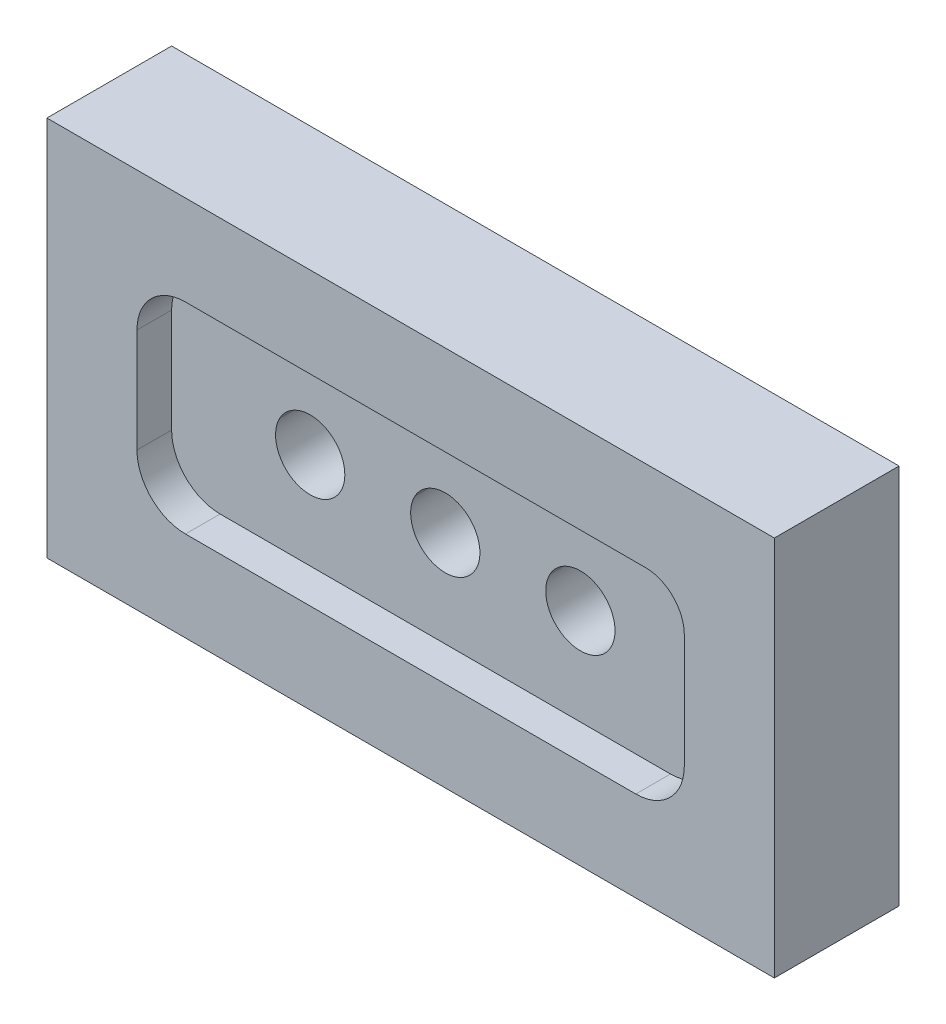
ISO-10303-21;
HEADER;
FILE_DESCRIPTION(('STEP AP214'),'2;1');
FILE_NAME('part.step','',(''),(''),'','','');
FILE_SCHEMA(('AUTOMOTIVE_DESIGN { 1 0 10303 214 1 1 1 1 }'));
ENDSEC;
DATA;
#1=APPLICATION_CONTEXT('core data for automotive mechanical design processes');
#2=APPLICATION_PROTOCOL_DEFINITION('international standard','automotive_design',2000,#1);
#3=PRODUCT_CONTEXT('',#1,'mechanical');
#4=PRODUCT('Part','Part','',(#3));
#5=PRODUCT_RELATED_PRODUCT_CATEGORY('part','',(#4));
#6=PRODUCT_DEFINITION_FORMATION('','',#4);
#7=PRODUCT_DEFINITION_CONTEXT('part definition',#1,'design');
#8=PRODUCT_DEFINITION('design','',#6,#7);
#9=PRODUCT_DEFINITION_SHAPE('','',#8);
#10=(LENGTH_UNIT() NAMED_UNIT(*) SI_UNIT(.MILLI.,.METRE.));
#11=(NAMED_UNIT(*) PLANE_ANGLE_UNIT() SI_UNIT($,.RADIAN.));
#12=(NAMED_UNIT(*) SI_UNIT($,.STERADIAN.) SOLID_ANGLE_UNIT());
#13=UNCERTAINTY_MEASURE_WITH_UNIT(LENGTH_MEASURE(1.E-05),#10,'distance_accuracy_value','');
#14=(GEOMETRIC_REPRESENTATION_CONTEXT(3) GLOBAL_UNCERTAINTY_ASSIGNED_CONTEXT((#13)) GLOBAL_UNIT_ASSIGNED_CONTEXT((#10,
#11,#12)) REPRESENTATION_CONTEXT('',''));
#15=CARTESIAN_POINT('',(0.,0.,0.));
#16=DIRECTION('',(0.,0.,1.));
#17=DIRECTION('',(1.,0.,0.));
#18=AXIS2_PLACEMENT_3D('',#15,#16,#17);
#19=CARTESIAN_POINT('',(105.,36.8980255127,12.9));
#20=DIRECTION('',(0.,0.,-1.));
#21=DIRECTION('',(0.877582561890372,-0.479425538604204,0.));
#22=AXIS2_PLACEMENT_3D('',#19,#20,#21);
#23=CYLINDRICAL_SURFACE('',#22,5.);
#24=CARTESIAN_POINT('',(105.,36.8980255127,13.));
#25=DIRECTION('',(0.,0.,1.));
#26=DIRECTION('',(1.,0.,0.));
#27=AXIS2_PLACEMENT_3D('',#24,#25,#26);
#28=CIRCLE('',#27,5.);
#29=CARTESIAN_POINT('',(100.612087191,39.2951532057,13.));
#30=VERTEX_POINT('',#29);
#31=CARTESIAN_POINT('',(109.387912809,34.5008978197,13.));
#32=VERTEX_POINT('',#31);
#33=EDGE_CURVE('E221',#30,#32,#28,.T.);
#34=ORIENTED_EDGE('',*,*,#33,.T.);
#35=DIRECTION('',(0.,0.,1.));
#36=VECTOR('',#35,1.);
#37=CARTESIAN_POINT('',(109.387912809,34.5008978197,10.6550000001));
#38=LINE('',#37,#36);
#39=CARTESIAN_POINT('',(109.387912809,34.5008978197,3.));
#40=VERTEX_POINT('',#39);
#41=EDGE_CURVE('E9',#40,#32,#38,.T.);
#42=ORIENTED_EDGE('',*,*,#41,.F.);
#43=CARTESIAN_POINT('',(105.,36.8980255127,3.));
#44=DIRECTION('',(0.,0.,-1.));
#45=DIRECTION('',(1.,0.,0.));
#46=AXIS2_PLACEMENT_3D('',#43,#44,#45);
#47=CIRCLE('',#46,5.);
#48=CARTESIAN_POINT('',(100.612087191,39.2951532057,3.));
#49=VERTEX_POINT('',#48);
#50=EDGE_CURVE('E210',#40,#49,#47,.T.);
#51=ORIENTED_EDGE('',*,*,#50,.T.);
#52=DIRECTION('',(0.,0.,1.));
#53=VECTOR('',#52,1.);
#54=CARTESIAN_POINT('',(100.612087191,39.2951532057,10.6550000001));
#55=LINE('',#54,#53);
#56=EDGE_CURVE('E26',#49,#30,#55,.T.);
#57=ORIENTED_EDGE('',*,*,#56,.T.);
#58=EDGE_LOOP('',(#34,#42,#51,#57));
#59=FACE_BOUND('',#58,.T.);
#60=ADVANCED_FACE('F15',(#59),#23,.F.);
#61=CARTESIAN_POINT('',(105.,36.8980255127,12.9));
#62=DIRECTION('',(0.,0.,-1.));
#63=DIRECTION('',(0.877582561890372,-0.479425538604204,0.));
#64=AXIS2_PLACEMENT_3D('',#61,#62,#63);
#65=CYLINDRICAL_SURFACE('',#64,5.);
#66=CARTESIAN_POINT('',(105.,36.8980255127,13.));
#67=DIRECTION('',(0.,0.,1.));
#68=DIRECTION('',(1.,0.,0.));
#69=AXIS2_PLACEMENT_3D('',#66,#67,#68);
#70=CIRCLE('',#69,5.);
#71=EDGE_CURVE('E225',#32,#30,#70,.T.);
#72=ORIENTED_EDGE('',*,*,#71,.T.);
#73=ORIENTED_EDGE('',*,*,#56,.F.);
#74=CARTESIAN_POINT('',(105.,36.8980255127,3.));
#75=DIRECTION('',(0.,0.,-1.));
#76=DIRECTION('',(1.,0.,0.));
#77=AXIS2_PLACEMENT_3D('',#74,#75,#76);
#78=CIRCLE('',#77,5.);
#79=EDGE_CURVE('E347',#49,#40,#78,.T.);
#80=ORIENTED_EDGE('',*,*,#79,.T.);
#81=ORIENTED_EDGE('',*,*,#41,.T.);
#82=EDGE_LOOP('',(#72,#73,#80,#81));
#83=FACE_BOUND('',#82,.T.);
#84=ADVANCED_FACE('F370',(#83),#65,.F.);
#85=CARTESIAN_POINT('',(85.5,36.8980255127,12.9));
#86=DIRECTION('',(0.,0.,-1.));
#87=DIRECTION('',(0.877582561890372,-0.479425538604204,0.));
#88=AXIS2_PLACEMENT_3D('',#85,#86,#87);
#89=CYLINDRICAL_SURFACE('',#88,5.);
#90=CARTESIAN_POINT('',(85.5,36.8980255127,13.));
#91=DIRECTION('',(0.,0.,1.));
#92=DIRECTION('',(1.,0.,0.));
#93=AXIS2_PLACEMENT_3D('',#90,#91,#92);
#94=CIRCLE('',#93,5.);
#95=CARTESIAN_POINT('',(81.1120871905,39.2951532057,13.));
#96=VERTEX_POINT('',#95);
#97=CARTESIAN_POINT('',(89.8879128095,34.5008978197,13.));
#98=VERTEX_POINT('',#97);
#99=EDGE_CURVE('E254',#96,#98,#94,.T.);
#100=ORIENTED_EDGE('',*,*,#99,.T.);
#101=DIRECTION('',(0.,0.,1.));
#102=VECTOR('',#101,1.);
#103=CARTESIAN_POINT('',(89.8879128095,34.5008978197,10.6550000001));
#104=LINE('',#103,#102);
#105=CARTESIAN_POINT('',(89.8879128095,34.5008978197,3.));
#106=VERTEX_POINT('',#105);
#107=EDGE_CURVE('E212',#106,#98,#104,.T.);
#108=ORIENTED_EDGE('',*,*,#107,.F.);
#109=CARTESIAN_POINT('',(85.5,36.8980255127,3.));
#110=DIRECTION('',(0.,0.,-1.));
#111=DIRECTION('',(1.,0.,0.));
#112=AXIS2_PLACEMENT_3D('',#109,#110,#111);
#113=CIRCLE('',#112,5.);
#114=CARTESIAN_POINT('',(81.1120871905,39.2951532057,3.));
#115=VERTEX_POINT('',#114);
#116=EDGE_CURVE('E263',#106,#115,#113,.T.);
#117=ORIENTED_EDGE('',*,*,#116,.T.);
#118=DIRECTION('',(0.,0.,1.));
#119=VECTOR('',#118,1.);
#120=CARTESIAN_POINT('',(81.1120871905,39.2951532057,10.6550000001));
#121=LINE('',#120,#119);
#122=EDGE_CURVE('E214',#115,#96,#121,.T.);
#123=ORIENTED_EDGE('',*,*,#122,.T.);
#124=EDGE_LOOP('',(#100,#108,#117,#123));
#125=FACE_BOUND('',#124,.T.);
#126=ADVANCED_FACE('F375',(#125),#89,.F.);
#127=CARTESIAN_POINT('',(85.5,36.8980255127,12.9));
#128=DIRECTION('',(0.,0.,-1.));
#129=DIRECTION('',(0.877582561890372,-0.479425538604204,0.));
#130=AXIS2_PLACEMENT_3D('',#127,#128,#129);
#131=CYLINDRICAL_SURFACE('',#130,5.);
#132=CARTESIAN_POINT('',(85.5,36.8980255127,13.));
#133=DIRECTION('',(0.,0.,1.));
#134=DIRECTION('',(1.,0.,0.));
#135=AXIS2_PLACEMENT_3D('',#132,#133,#134);
#136=CIRCLE('',#135,5.);
#137=EDGE_CURVE('E258',#98,#96,#136,.T.);
#138=ORIENTED_EDGE('',*,*,#137,.T.);
#139=ORIENTED_EDGE('',*,*,#122,.F.);
#140=CARTESIAN_POINT('',(85.5,36.8980255127,3.));
#141=DIRECTION('',(0.,0.,-1.));
#142=DIRECTION('',(1.,0.,0.));
#143=AXIS2_PLACEMENT_3D('',#140,#141,#142);
#144=CIRCLE('',#143,5.);
#145=EDGE_CURVE('E259',#115,#106,#144,.T.);
#146=ORIENTED_EDGE('',*,*,#145,.T.);
#147=ORIENTED_EDGE('',*,*,#107,.T.);
#148=EDGE_LOOP('',(#138,#139,#146,#147));
#149=FACE_BOUND('',#148,.T.);
#150=ADVANCED_FACE('F494',(#149),#131,.F.);
#151=CARTESIAN_POINT('',(66.,36.8980255127,12.9));
#152=DIRECTION('',(0.,0.,-1.));
#153=DIRECTION('',(0.877582561890372,-0.479425538604204,0.));
#154=AXIS2_PLACEMENT_3D('',#151,#152,#153);
#155=CYLINDRICAL_SURFACE('',#154,5.);
#156=CARTESIAN_POINT('',(66.,36.8980255127,13.));
#157=DIRECTION('',(0.,0.,1.));
#158=DIRECTION('',(1.,0.,0.));
#159=AXIS2_PLACEMENT_3D('',#156,#157,#158);
#160=CIRCLE('',#159,5.);
#161=CARTESIAN_POINT('',(61.6120871905,39.2951532057,13.));
#162=VERTEX_POINT('',#161);
#163=CARTESIAN_POINT('',(70.3879128095,34.5008978197,13.));
#164=VERTEX_POINT('',#163);
#165=EDGE_CURVE('E302',#162,#164,#160,.T.);
#166=ORIENTED_EDGE('',*,*,#165,.T.);
#167=DIRECTION('',(0.,0.,1.));
#168=VECTOR('',#167,1.);
#169=CARTESIAN_POINT('',(70.3879128095,34.5008978197,10.6550000001));
#170=LINE('',#169,#168);
#171=CARTESIAN_POINT('',(70.3879128095,34.5008978197,3.));
#172=VERTEX_POINT('',#171);
#173=EDGE_CURVE('E40',#172,#164,#170,.T.);
#174=ORIENTED_EDGE('',*,*,#173,.F.);
#175=CARTESIAN_POINT('',(66.,36.8980255127,3.));
#176=DIRECTION('',(0.,0.,-1.));
#177=DIRECTION('',(1.,0.,0.));
#178=AXIS2_PLACEMENT_3D('',#175,#176,#177);
#179=CIRCLE('',#178,5.);
#180=CARTESIAN_POINT('',(61.6120871905,39.2951532057,3.));
#181=VERTEX_POINT('',#180);
#182=EDGE_CURVE('E253',#172,#181,#179,.T.);
#183=ORIENTED_EDGE('',*,*,#182,.T.);
#184=DIRECTION('',(0.,0.,1.));
#185=VECTOR('',#184,1.);
#186=CARTESIAN_POINT('',(61.6120871905,39.2951532057,10.6550000001));
#187=LINE('',#186,#185);
#188=EDGE_CURVE('E250',#181,#162,#187,.T.);
#189=ORIENTED_EDGE('',*,*,#188,.T.);
#190=EDGE_LOOP('',(#166,#174,#183,#189));
#191=FACE_BOUND('',#190,.T.);
#192=ADVANCED_FACE('F322',(#191),#155,.F.);
#193=CARTESIAN_POINT('',(66.,36.8980255127,12.9));
#194=DIRECTION('',(0.,0.,-1.));
#195=DIRECTION('',(0.877582561890372,-0.479425538604204,0.));
#196=AXIS2_PLACEMENT_3D('',#193,#194,#195);
#197=CYLINDRICAL_SURFACE('',#196,5.);
#198=CARTESIAN_POINT('',(66.,36.8980255127,13.));
#199=DIRECTION('',(0.,0.,1.));
#200=DIRECTION('',(1.,0.,0.));
#201=AXIS2_PLACEMENT_3D('',#198,#199,#200);
#202=CIRCLE('',#201,5.);
#203=EDGE_CURVE('E297',#164,#162,#202,.T.);
#204=ORIENTED_EDGE('',*,*,#203,.T.);
#205=ORIENTED_EDGE('',*,*,#188,.F.);
#206=CARTESIAN_POINT('',(66.,36.8980255127,3.));
#207=DIRECTION('',(0.,0.,-1.));
#208=DIRECTION('',(1.,0.,0.));
#209=AXIS2_PLACEMENT_3D('',#206,#207,#208);
#210=CIRCLE('',#209,5.);
#211=EDGE_CURVE('E269',#181,#172,#210,.T.);
#212=ORIENTED_EDGE('',*,*,#211,.T.);
#213=ORIENTED_EDGE('',*,*,#173,.T.);
#214=EDGE_LOOP('',(#204,#205,#212,#213));
#215=FACE_BOUND('',#214,.T.);
#216=ADVANCED_FACE('F317',(#215),#197,.F.);
#217=CARTESIAN_POINT('',(66.,36.8980255127,3.));
#218=DIRECTION('',(0.,0.,-1.));
#219=DIRECTION('',(0.,-1.,0.));
#220=AXIS2_PLACEMENT_3D('',#217,#218,#219);
#221=PLANE('',#220);
#222=ORIENTED_EDGE('',*,*,#211,.F.);
#223=ORIENTED_EDGE('',*,*,#182,.F.);
#224=EDGE_LOOP('',(#222,#223));
#225=FACE_BOUND('',#224,.T.);
#226=ADVANCED_FACE('F383',(#225),#221,.F.);
#227=CARTESIAN_POINT('',(66.,36.8980255127,3.));
#228=DIRECTION('',(0.,0.,-1.));
#229=DIRECTION('',(0.,-1.,0.));
#230=AXIS2_PLACEMENT_3D('',#227,#228,#229);
#231=PLANE('',#230);
#232=ORIENTED_EDGE('',*,*,#145,.F.);
#233=ORIENTED_EDGE('',*,*,#116,.F.);
#234=EDGE_LOOP('',(#232,#233));
#235=FACE_BOUND('',#234,.T.);
#236=ADVANCED_FACE('F379',(#235),#231,.F.);
#237=CARTESIAN_POINT('',(0.,0.,0.));
#238=DIRECTION('',(0.,0.,1.));
#239=DIRECTION('',(1.,0.,0.));
#240=AXIS2_PLACEMENT_3D('',#237,#238,#239);
#241=PLANE('',#240);
#242=DIRECTION('',(-1.,0.,0.));
#243=VECTOR('',#242,1.);
#244=CARTESIAN_POINT('',(85.5,65.,0.));
#245=LINE('',#244,#243);
#246=CARTESIAN_POINT('',(138.,65.,0.));
#247=VERTEX_POINT('',#246);
#248=CARTESIAN_POINT('',(33.,65.,0.));
#249=VERTEX_POINT('',#248);
#250=EDGE_CURVE('E264',#247,#249,#245,.T.);
#251=ORIENTED_EDGE('',*,*,#250,.F.);
#252=DIRECTION('',(0.,1.,0.));
#253=VECTOR('',#252,1.);
#254=CARTESIAN_POINT('',(138.,37.5,0.));
#255=LINE('',#254,#253);
#256=CARTESIAN_POINT('',(138.,10.,0.));
#257=VERTEX_POINT('',#256);
#258=EDGE_CURVE('E275',#257,#247,#255,.T.);
#259=ORIENTED_EDGE('',*,*,#258,.F.);
#260=DIRECTION('',(1.,0.,0.));
#261=VECTOR('',#260,1.);
#262=CARTESIAN_POINT('',(85.5,10.,0.));
#263=LINE('',#262,#261);
#264=CARTESIAN_POINT('',(33.,10.,0.));
#265=VERTEX_POINT('',#264);
#266=EDGE_CURVE('E344',#265,#257,#263,.T.);
#267=ORIENTED_EDGE('',*,*,#266,.F.);
#268=DIRECTION('',(0.,-1.,0.));
#269=VECTOR('',#268,1.);
#270=CARTESIAN_POINT('',(33.,37.5,0.));
#271=LINE('',#270,#269);
#272=EDGE_CURVE('E239',#249,#265,#271,.T.);
#273=ORIENTED_EDGE('',*,*,#272,.F.);
#274=EDGE_LOOP('',(#251,#259,#267,#273));
#275=FACE_BOUND('',#274,.T.);
#276=ADVANCED_FACE('F382',(#275),#241,.F.);
#277=CARTESIAN_POINT('',(33.,65.,0.));
#278=DIRECTION('',(0.,-1.,0.));
#279=DIRECTION('',(0.,0.,-1.));
#280=AXIS2_PLACEMENT_3D('',#277,#278,#279);
#281=PLANE('',#280);
#282=DIRECTION('',(0.,0.,1.));
#283=VECTOR('',#282,1.);
#284=CARTESIAN_POINT('',(138.,65.,9.));
#285=LINE('',#284,#283);
#286=CARTESIAN_POINT('',(138.,65.,18.));
#287=VERTEX_POINT('',#286);
#288=EDGE_CURVE('E279',#247,#287,#285,.T.);
#289=ORIENTED_EDGE('',*,*,#288,.F.);
#290=ORIENTED_EDGE('',*,*,#250,.T.);
#291=DIRECTION('',(0.,0.,1.));
#292=VECTOR('',#291,1.);
#293=CARTESIAN_POINT('',(33.,65.,9.));
#294=LINE('',#293,#292);
#295=CARTESIAN_POINT('',(33.,65.,18.));
#296=VERTEX_POINT('',#295);
#297=EDGE_CURVE('E244',#249,#296,#294,.T.);
#298=ORIENTED_EDGE('',*,*,#297,.T.);
#299=DIRECTION('',(-1.,0.,0.));
#300=VECTOR('',#299,1.);
#301=CARTESIAN_POINT('',(85.5,65.,18.));
#302=LINE('',#301,#300);
#303=EDGE_CURVE('E249',#287,#296,#302,.T.);
#304=ORIENTED_EDGE('',*,*,#303,.F.);
#305=EDGE_LOOP('',(#289,#290,#298,#304));
#306=FACE_BOUND('',#305,.T.);
#307=ADVANCED_FACE('F385',(#306),#281,.F.);
#308=CARTESIAN_POINT('',(138.,10.,0.));
#309=DIRECTION('',(1.,0.,0.));
#310=DIRECTION('',(0.,1.,0.));
#311=AXIS2_PLACEMENT_3D('',#308,#309,#310);
#312=PLANE('',#311);
#313=DIRECTION('',(0.,0.,1.));
#314=VECTOR('',#313,1.);
#315=CARTESIAN_POINT('',(138.,10.,9.));
#316=LINE('',#315,#314);
#317=CARTESIAN_POINT('',(138.,10.,18.));
#318=VERTEX_POINT('',#317);
#319=EDGE_CURVE('E280',#257,#318,#316,.T.);
#320=ORIENTED_EDGE('',*,*,#319,.F.);
#321=ORIENTED_EDGE('',*,*,#258,.T.);
#322=ORIENTED_EDGE('',*,*,#288,.T.);
#323=DIRECTION('',(0.,1.,0.));
#324=VECTOR('',#323,1.);
#325=CARTESIAN_POINT('',(138.,37.5,18.));
#326=LINE('',#325,#324);
#327=EDGE_CURVE('E245',#318,#287,#326,.T.);
#328=ORIENTED_EDGE('',*,*,#327,.F.);
#329=EDGE_LOOP('',(#320,#321,#322,#328));
#330=FACE_BOUND('',#329,.T.);
#331=ADVANCED_FACE('F388',(#330),#312,.T.);
#332=CARTESIAN_POINT('',(138.,10.,0.));
#333=DIRECTION('',(0.,1.,0.));
#334=DIRECTION('',(1.,0.,0.));
#335=AXIS2_PLACEMENT_3D('',#332,#333,#334);
#336=PLANE('',#335);
#337=DIRECTION('',(0.,0.,1.));
#338=VECTOR('',#337,1.);
#339=CARTESIAN_POINT('',(33.,10.,9.));
#340=LINE('',#339,#338);
#341=CARTESIAN_POINT('',(33.,10.,18.));
#342=VERTEX_POINT('',#341);
#343=EDGE_CURVE('E243',#265,#342,#340,.T.);
#344=ORIENTED_EDGE('',*,*,#343,.F.);
#345=ORIENTED_EDGE('',*,*,#266,.T.);
#346=ORIENTED_EDGE('',*,*,#319,.T.);
#347=DIRECTION('',(1.,0.,0.));
#348=VECTOR('',#347,1.);
#349=CARTESIAN_POINT('',(85.5,10.,18.));
#350=LINE('',#349,#348);
#351=EDGE_CURVE('E237',#342,#318,#350,.T.);
#352=ORIENTED_EDGE('',*,*,#351,.F.);
#353=EDGE_LOOP('',(#344,#345,#346,#352));
#354=FACE_BOUND('',#353,.T.);
#355=ADVANCED_FACE('F407',(#354),#336,.F.);
#356=CARTESIAN_POINT('',(33.,65.,0.));
#357=DIRECTION('',(-1.,0.,0.));
#358=DIRECTION('',(0.,0.,1.));
#359=AXIS2_PLACEMENT_3D('',#356,#357,#358);
#360=PLANE('',#359);
#361=ORIENTED_EDGE('',*,*,#297,.F.);
#362=ORIENTED_EDGE('',*,*,#272,.T.);
#363=ORIENTED_EDGE('',*,*,#343,.T.);
#364=DIRECTION('',(0.,-1.,0.));
#365=VECTOR('',#364,1.);
#366=CARTESIAN_POINT('',(33.,37.5,18.));
#367=LINE('',#366,#365);
#368=EDGE_CURVE('E233',#296,#342,#367,.T.);
#369=ORIENTED_EDGE('',*,*,#368,.F.);
#370=EDGE_LOOP('',(#361,#362,#363,#369));
#371=FACE_BOUND('',#370,.T.);
#372=ADVANCED_FACE('F394',(#371),#360,.T.);
#373=CARTESIAN_POINT('',(0.,0.,18.));
#374=DIRECTION('',(0.,0.,1.));
#375=DIRECTION('',(1.,0.,0.));
#376=AXIS2_PLACEMENT_3D('',#373,#374,#375);
#377=PLANE('',#376);
#378=CARTESIAN_POINT('',(119.412055492,46.4120554918,18.));
#379=DIRECTION('',(0.,0.,1.));
#380=DIRECTION('',(1.,0.,0.));
#381=AXIS2_PLACEMENT_3D('',#378,#379,#380);
#382=CIRCLE('',#381,5.58794450821);
#383=CARTESIAN_POINT('',(125.,46.4120554918,18.));
#384=VERTEX_POINT('',#383);
#385=CARTESIAN_POINT('',(119.412055492,52.,18.));
#386=VERTEX_POINT('',#385);
#387=EDGE_CURVE('E184',#384,#386,#382,.T.);
#388=ORIENTED_EDGE('',*,*,#387,.F.);
#389=DIRECTION('',(0.,1.,0.));
#390=VECTOR('',#389,1.);
#391=CARTESIAN_POINT('',(125.,38.2060277459,18.));
#392=LINE('',#391,#390);
#393=CARTESIAN_POINT('',(125.,30.,18.));
#394=VERTEX_POINT('',#393);
#395=EDGE_CURVE('E180',#394,#384,#392,.T.);
#396=ORIENTED_EDGE('',*,*,#395,.F.);
#397=CARTESIAN_POINT('',(118.,30.,18.));
#398=DIRECTION('',(0.,0.,1.));
#399=DIRECTION('',(1.,0.,0.));
#400=AXIS2_PLACEMENT_3D('',#397,#398,#399);
#401=CIRCLE('',#400,7.);
#402=CARTESIAN_POINT('',(118.,23.,18.));
#403=VERTEX_POINT('',#402);
#404=EDGE_CURVE('E228',#403,#394,#401,.T.);
#405=ORIENTED_EDGE('',*,*,#404,.F.);
#406=DIRECTION('',(1.,0.,0.));
#407=VECTOR('',#406,1.);
#408=CARTESIAN_POINT('',(85.5,23.,18.));
#409=LINE('',#408,#407);
#410=CARTESIAN_POINT('',(53.,23.,18.));
#411=VERTEX_POINT('',#410);
#412=EDGE_CURVE('E229',#411,#403,#409,.T.);
#413=ORIENTED_EDGE('',*,*,#412,.F.);
#414=CARTESIAN_POINT('',(53.,30.,18.));
#415=DIRECTION('',(0.,0.,1.));
#416=DIRECTION('',(1.,0.,0.));
#417=AXIS2_PLACEMENT_3D('',#414,#415,#416);
#418=CIRCLE('',#417,7.);
#419=CARTESIAN_POINT('',(46.,30.,18.));
#420=VERTEX_POINT('',#419);
#421=EDGE_CURVE('E232',#420,#411,#418,.T.);
#422=ORIENTED_EDGE('',*,*,#421,.F.);
#423=DIRECTION('',(0.,-1.,0.));
#424=VECTOR('',#423,1.);
#425=CARTESIAN_POINT('',(46.,37.5,18.));
#426=LINE('',#425,#424);
#427=CARTESIAN_POINT('',(46.,45.,18.));
#428=VERTEX_POINT('',#427);
#429=EDGE_CURVE('E215',#428,#420,#426,.T.);
#430=ORIENTED_EDGE('',*,*,#429,.F.);
#431=CARTESIAN_POINT('',(53.,45.,18.));
#432=DIRECTION('',(0.,0.,1.));
#433=DIRECTION('',(1.,0.,0.));
#434=AXIS2_PLACEMENT_3D('',#431,#432,#433);
#435=CIRCLE('',#434,7.);
#436=CARTESIAN_POINT('',(53.,52.,18.));
#437=VERTEX_POINT('',#436);
#438=EDGE_CURVE('E306',#437,#428,#435,.T.);
#439=ORIENTED_EDGE('',*,*,#438,.F.);
#440=DIRECTION('',(-1.,0.,0.));
#441=VECTOR('',#440,1.);
#442=CARTESIAN_POINT('',(86.2060277459,52.,18.));
#443=LINE('',#442,#441);
#444=EDGE_CURVE('E238',#386,#437,#443,.T.);
#445=ORIENTED_EDGE('',*,*,#444,.F.);
#446=EDGE_LOOP('',(#388,#396,#405,#413,#422,#430,#439,#445));
#447=FACE_BOUND('',#446,.T.);
#448=ORIENTED_EDGE('',*,*,#368,.T.);
#449=ORIENTED_EDGE('',*,*,#351,.T.);
#450=ORIENTED_EDGE('',*,*,#327,.T.);
#451=ORIENTED_EDGE('',*,*,#303,.T.);
#452=EDGE_LOOP('',(#448,#449,#450,#451));
#453=FACE_BOUND('',#452,.T.);
#454=ADVANCED_FACE('F390',(#447,#453),#377,.T.);
#455=CARTESIAN_POINT('',(53.,52.,18.));
#456=DIRECTION('',(0.,1.,0.));
#457=DIRECTION('',(1.,0.,0.));
#458=AXIS2_PLACEMENT_3D('',#455,#456,#457);
#459=PLANE('',#458);
#460=DIRECTION('',(0.,0.,-1.));
#461=VECTOR('',#460,1.);
#462=CARTESIAN_POINT('',(119.412055492,52.,15.5));
#463=LINE('',#462,#461);
#464=CARTESIAN_POINT('',(119.412055492,52.,13.));
#465=VERTEX_POINT('',#464);
#466=EDGE_CURVE('E190',#386,#465,#463,.T.);
#467=ORIENTED_EDGE('',*,*,#466,.F.);
#468=ORIENTED_EDGE('',*,*,#444,.T.);
#469=DIRECTION('',(0.,0.,-1.));
#470=VECTOR('',#469,1.);
#471=CARTESIAN_POINT('',(53.,52.,15.5));
#472=LINE('',#471,#470);
#473=CARTESIAN_POINT('',(53.,52.,13.));
#474=VERTEX_POINT('',#473);
#475=EDGE_CURVE('E301',#437,#474,#472,.T.);
#476=ORIENTED_EDGE('',*,*,#475,.T.);
#477=DIRECTION('',(-1.,0.,0.));
#478=VECTOR('',#477,1.);
#479=CARTESIAN_POINT('',(86.2060277459,52.,13.));
#480=LINE('',#479,#478);
#481=EDGE_CURVE('E195',#465,#474,#480,.T.);
#482=ORIENTED_EDGE('',*,*,#481,.F.);
#483=EDGE_LOOP('',(#467,#468,#476,#482));
#484=FACE_BOUND('',#483,.T.);
#485=ADVANCED_FACE('F393',(#484),#459,.F.);
#486=CARTESIAN_POINT('',(119.412055492,46.4120554918,15.5));
#487=DIRECTION('',(0.,0.,1.));
#488=DIRECTION('',(1.,0.,0.));
#489=AXIS2_PLACEMENT_3D('',#486,#487,#488);
#490=CYLINDRICAL_SURFACE('',#489,5.58794450821);
#491=DIRECTION('',(0.,0.,-1.));
#492=VECTOR('',#491,1.);
#493=CARTESIAN_POINT('',(125.,46.4120554918,15.5));
#494=LINE('',#493,#492);
#495=CARTESIAN_POINT('',(125.,46.4120554918,13.));
#496=VERTEX_POINT('',#495);
#497=EDGE_CURVE('E173',#384,#496,#494,.T.);
#498=ORIENTED_EDGE('',*,*,#497,.F.);
#499=ORIENTED_EDGE('',*,*,#387,.T.);
#500=ORIENTED_EDGE('',*,*,#466,.T.);
#501=CARTESIAN_POINT('',(119.412055492,46.4120554918,13.));
#502=DIRECTION('',(0.,0.,1.));
#503=DIRECTION('',(1.,0.,0.));
#504=AXIS2_PLACEMENT_3D('',#501,#502,#503);
#505=CIRCLE('',#504,5.58794450821);
#506=EDGE_CURVE('E187',#496,#465,#505,.T.);
#507=ORIENTED_EDGE('',*,*,#506,.F.);
#508=EDGE_LOOP('',(#498,#499,#500,#507));
#509=FACE_BOUND('',#508,.T.);
#510=ADVANCED_FACE('F188',(#509),#490,.F.);
#511=CARTESIAN_POINT('',(125.,30.,18.));
#512=DIRECTION('',(-1.,0.,0.));
#513=DIRECTION('',(0.,0.,1.));
#514=AXIS2_PLACEMENT_3D('',#511,#512,#513);
#515=PLANE('',#514);
#516=DIRECTION('',(0.,0.,-1.));
#517=VECTOR('',#516,1.);
#518=CARTESIAN_POINT('',(125.,30.,15.5));
#519=LINE('',#518,#517);
#520=CARTESIAN_POINT('',(125.,30.,13.));
#521=VERTEX_POINT('',#520);
#522=EDGE_CURVE('E272',#394,#521,#519,.T.);
#523=ORIENTED_EDGE('',*,*,#522,.F.);
#524=ORIENTED_EDGE('',*,*,#395,.T.);
#525=ORIENTED_EDGE('',*,*,#497,.T.);
#526=DIRECTION('',(0.,1.,0.));
#527=VECTOR('',#526,1.);
#528=CARTESIAN_POINT('',(125.,38.2060277459,13.));
#529=LINE('',#528,#527);
#530=EDGE_CURVE('E178',#521,#496,#529,.T.);
#531=ORIENTED_EDGE('',*,*,#530,.F.);
#532=EDGE_LOOP('',(#523,#524,#525,#531));
#533=FACE_BOUND('',#532,.T.);
#534=ADVANCED_FACE('F176',(#533),#515,.T.);
#535=CARTESIAN_POINT('',(118.,30.,15.5));
#536=DIRECTION('',(0.,0.,1.));
#537=DIRECTION('',(0.,-1.,0.));
#538=AXIS2_PLACEMENT_3D('',#535,#536,#537);
#539=CYLINDRICAL_SURFACE('',#538,7.);
#540=DIRECTION('',(0.,0.,-1.));
#541=VECTOR('',#540,1.);
#542=CARTESIAN_POINT('',(118.,23.,15.5));
#543=LINE('',#542,#541);
#544=CARTESIAN_POINT('',(118.,23.,13.));
#545=VERTEX_POINT('',#544);
#546=EDGE_CURVE('E107',#403,#545,#543,.T.);
#547=ORIENTED_EDGE('',*,*,#546,.F.);
#548=ORIENTED_EDGE('',*,*,#404,.T.);
#549=ORIENTED_EDGE('',*,*,#522,.T.);
#550=CARTESIAN_POINT('',(118.,30.,13.));
#551=DIRECTION('',(0.,0.,1.));
#552=DIRECTION('',(1.,0.,0.));
#553=AXIS2_PLACEMENT_3D('',#550,#551,#552);
#554=CIRCLE('',#553,7.);
#555=EDGE_CURVE('E199',#545,#521,#554,.T.);
#556=ORIENTED_EDGE('',*,*,#555,.F.);
#557=EDGE_LOOP('',(#547,#548,#549,#556));
#558=FACE_BOUND('',#557,.T.);
#559=ADVANCED_FACE('F405',(#558),#539,.F.);
#560=CARTESIAN_POINT('',(118.,23.,18.));
#561=DIRECTION('',(0.,-1.,0.));
#562=DIRECTION('',(0.,0.,-1.));
#563=AXIS2_PLACEMENT_3D('',#560,#561,#562);
#564=PLANE('',#563);
#565=DIRECTION('',(0.,0.,-1.));
#566=VECTOR('',#565,1.);
#567=CARTESIAN_POINT('',(53.,23.,15.5));
#568=LINE('',#567,#566);
#569=CARTESIAN_POINT('',(53.,23.,13.));
#570=VERTEX_POINT('',#569);
#571=EDGE_CURVE('E121',#411,#570,#568,.T.);
#572=ORIENTED_EDGE('',*,*,#571,.F.);
#573=ORIENTED_EDGE('',*,*,#412,.T.);
#574=ORIENTED_EDGE('',*,*,#546,.T.);
#575=DIRECTION('',(1.,0.,0.));
#576=VECTOR('',#575,1.);
#577=CARTESIAN_POINT('',(85.5,23.,13.));
#578=LINE('',#577,#576);
#579=EDGE_CURVE('E206',#570,#545,#578,.T.);
#580=ORIENTED_EDGE('',*,*,#579,.F.);
#581=EDGE_LOOP('',(#572,#573,#574,#580));
#582=FACE_BOUND('',#581,.T.);
#583=ADVANCED_FACE('F402',(#582),#564,.F.);
#584=CARTESIAN_POINT('',(53.,30.,15.5));
#585=DIRECTION('',(0.,0.,1.));
#586=DIRECTION('',(-1.,0.,0.));
#587=AXIS2_PLACEMENT_3D('',#584,#585,#586);
#588=CYLINDRICAL_SURFACE('',#587,7.);
#589=DIRECTION('',(0.,0.,-1.));
#590=VECTOR('',#589,1.);
#591=CARTESIAN_POINT('',(46.,30.,15.5));
#592=LINE('',#591,#590);
#593=CARTESIAN_POINT('',(46.,30.,13.));
#594=VERTEX_POINT('',#593);
#595=EDGE_CURVE('E218',#420,#594,#592,.T.);
#596=ORIENTED_EDGE('',*,*,#595,.F.);
#597=ORIENTED_EDGE('',*,*,#421,.T.);
#598=ORIENTED_EDGE('',*,*,#571,.T.);
#599=CARTESIAN_POINT('',(53.,30.,13.));
#600=DIRECTION('',(0.,0.,1.));
#601=DIRECTION('',(1.,0.,0.));
#602=AXIS2_PLACEMENT_3D('',#599,#600,#601);
#603=CIRCLE('',#602,7.);
#604=EDGE_CURVE('E19',#594,#570,#603,.T.);
#605=ORIENTED_EDGE('',*,*,#604,.F.);
#606=EDGE_LOOP('',(#596,#597,#598,#605));
#607=FACE_BOUND('',#606,.T.);
#608=ADVANCED_FACE('F404',(#607),#588,.F.);
#609=CARTESIAN_POINT('',(46.,45.,18.));
#610=DIRECTION('',(1.,0.,0.));
#611=DIRECTION('',(0.,1.,0.));
#612=AXIS2_PLACEMENT_3D('',#609,#610,#611);
#613=PLANE('',#612);
#614=DIRECTION('',(0.,0.,-1.));
#615=VECTOR('',#614,1.);
#616=CARTESIAN_POINT('',(46.,45.,15.5));
#617=LINE('',#616,#615);
#618=CARTESIAN_POINT('',(46.,45.,13.));
#619=VERTEX_POINT('',#618);
#620=EDGE_CURVE('E219',#428,#619,#617,.T.);
#621=ORIENTED_EDGE('',*,*,#620,.F.);
#622=ORIENTED_EDGE('',*,*,#429,.T.);
#623=ORIENTED_EDGE('',*,*,#595,.T.);
#624=DIRECTION('',(0.,-1.,0.));
#625=VECTOR('',#624,1.);
#626=CARTESIAN_POINT('',(46.,37.5,13.));
#627=LINE('',#626,#625);
#628=EDGE_CURVE('E307',#619,#594,#627,.T.);
#629=ORIENTED_EDGE('',*,*,#628,.F.);
#630=EDGE_LOOP('',(#621,#622,#623,#629));
#631=FACE_BOUND('',#630,.T.);
#632=ADVANCED_FACE('F461',(#631),#613,.T.);
#633=CARTESIAN_POINT('',(53.,45.,15.5));
#634=DIRECTION('',(0.,0.,1.));
#635=DIRECTION('',(0.,1.,0.));
#636=AXIS2_PLACEMENT_3D('',#633,#634,#635);
#637=CYLINDRICAL_SURFACE('',#636,7.);
#638=ORIENTED_EDGE('',*,*,#475,.F.);
#639=ORIENTED_EDGE('',*,*,#438,.T.);
#640=ORIENTED_EDGE('',*,*,#620,.T.);
#641=CARTESIAN_POINT('',(53.,45.,13.));
#642=DIRECTION('',(0.,0.,1.));
#643=DIRECTION('',(1.,0.,0.));
#644=AXIS2_PLACEMENT_3D('',#641,#642,#643);
#645=CIRCLE('',#644,7.);
#646=EDGE_CURVE('E310',#474,#619,#645,.T.);
#647=ORIENTED_EDGE('',*,*,#646,.F.);
#648=EDGE_LOOP('',(#638,#639,#640,#647));
#649=FACE_BOUND('',#648,.T.);
#650=ADVANCED_FACE('F366',(#649),#637,.F.);
#651=CARTESIAN_POINT('',(0.,0.,13.));
#652=DIRECTION('',(0.,0.,1.));
#653=DIRECTION('',(1.,0.,0.));
#654=AXIS2_PLACEMENT_3D('',#651,#652,#653);
#655=PLANE('',#654);
#656=ORIENTED_EDGE('',*,*,#165,.F.);
#657=ORIENTED_EDGE('',*,*,#203,.F.);
#658=EDGE_LOOP('',(#656,#657));
#659=FACE_BOUND('',#658,.T.);
#660=ORIENTED_EDGE('',*,*,#99,.F.);
#661=ORIENTED_EDGE('',*,*,#137,.F.);
#662=EDGE_LOOP('',(#660,#661));
#663=FACE_BOUND('',#662,.T.);
#664=ORIENTED_EDGE('',*,*,#33,.F.);
#665=ORIENTED_EDGE('',*,*,#71,.F.);
#666=EDGE_LOOP('',(#664,#665));
#667=FACE_BOUND('',#666,.T.);
#668=ORIENTED_EDGE('',*,*,#646,.T.);
#669=ORIENTED_EDGE('',*,*,#628,.T.);
#670=ORIENTED_EDGE('',*,*,#604,.T.);
#671=ORIENTED_EDGE('',*,*,#579,.T.);
#672=ORIENTED_EDGE('',*,*,#555,.T.);
#673=ORIENTED_EDGE('',*,*,#530,.T.);
#674=ORIENTED_EDGE('',*,*,#506,.T.);
#675=ORIENTED_EDGE('',*,*,#481,.T.);
#676=EDGE_LOOP('',(#668,#669,#670,#671,#672,#673,#674,#675));
#677=FACE_BOUND('',#676,.T.);
#678=ADVANCED_FACE('F17',(#659,#663,#667,#677),#655,.T.);
#679=CARTESIAN_POINT('',(66.,36.8980255127,3.));
#680=DIRECTION('',(0.,0.,-1.));
#681=DIRECTION('',(0.,-1.,0.));
#682=AXIS2_PLACEMENT_3D('',#679,#680,#681);
#683=PLANE('',#682);
#684=ORIENTED_EDGE('',*,*,#79,.F.);
#685=ORIENTED_EDGE('',*,*,#50,.F.);
#686=EDGE_LOOP('',(#684,#685));
#687=FACE_BOUND('',#686,.T.);
#688=ADVANCED_FACE('F359',(#687),#683,.F.);
#689=CLOSED_SHELL('',(#60,#84,#126,#150,#192,#216,#226,#236,#276,#307,#331,#355,#372,#454,#485,
#510,#534,#559,#583,#608,#632,#650,#678,#688));
#690=MANIFOLD_SOLID_BREP('B1',#689);
#691=ADVANCED_BREP_SHAPE_REPRESENTATION('',(#18,#690),#14);
#692=SHAPE_DEFINITION_REPRESENTATION(#9,#691);
ENDSEC;
END-ISO-10303-21;
